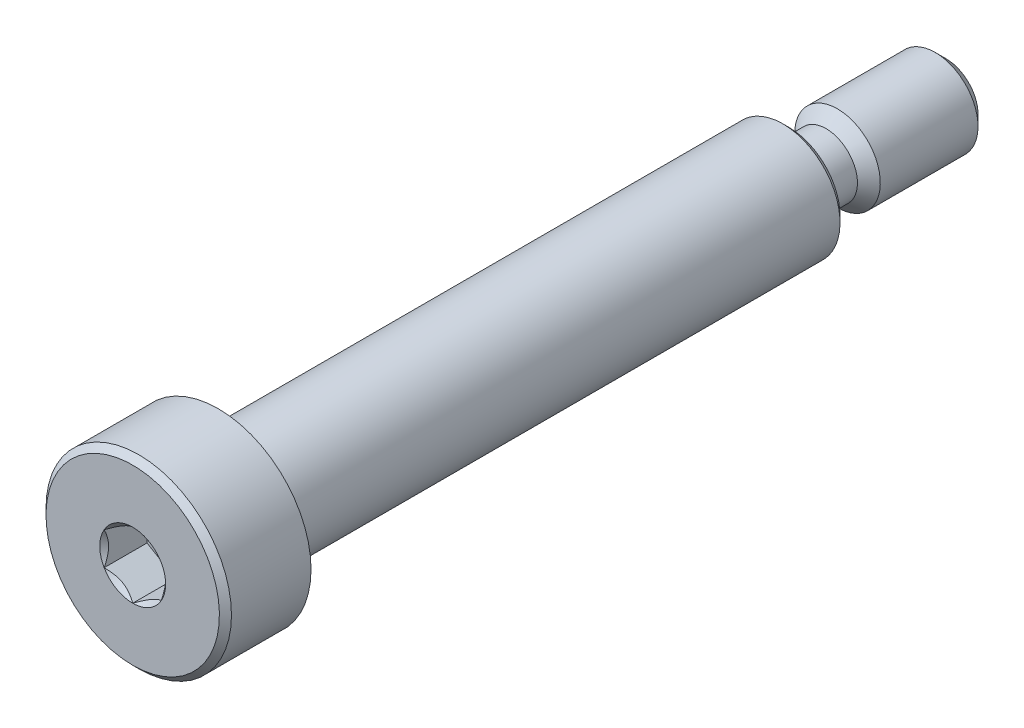
ISO-10303-21;
HEADER;
FILE_DESCRIPTION(('STEP AP214'),'2;1');
FILE_NAME('part.step','',(''),(''),'','','');
FILE_SCHEMA(('AUTOMOTIVE_DESIGN { 1 0 10303 214 1 1 1 1 }'));
ENDSEC;
DATA;
#1=APPLICATION_CONTEXT('core data for automotive mechanical design processes');
#2=APPLICATION_PROTOCOL_DEFINITION('international standard','automotive_design',2000,#1);
#3=PRODUCT_CONTEXT('',#1,'mechanical');
#4=PRODUCT('Part','Part','',(#3));
#5=PRODUCT_RELATED_PRODUCT_CATEGORY('part','',(#4));
#6=PRODUCT_DEFINITION_FORMATION('','',#4);
#7=PRODUCT_DEFINITION_CONTEXT('part definition',#1,'design');
#8=PRODUCT_DEFINITION('design','',#6,#7);
#9=PRODUCT_DEFINITION_SHAPE('','',#8);
#10=(LENGTH_UNIT() NAMED_UNIT(*) SI_UNIT(.MILLI.,.METRE.));
#11=(NAMED_UNIT(*) PLANE_ANGLE_UNIT() SI_UNIT($,.RADIAN.));
#12=(NAMED_UNIT(*) SI_UNIT($,.STERADIAN.) SOLID_ANGLE_UNIT());
#13=UNCERTAINTY_MEASURE_WITH_UNIT(LENGTH_MEASURE(1.E-05),#10,'distance_accuracy_value','');
#14=(GEOMETRIC_REPRESENTATION_CONTEXT(3) GLOBAL_UNCERTAINTY_ASSIGNED_CONTEXT((#13)) GLOBAL_UNIT_ASSIGNED_CONTEXT((#10,
#11,#12)) REPRESENTATION_CONTEXT('',''));
#15=CARTESIAN_POINT('',(0.,0.,0.));
#16=DIRECTION('',(0.,0.,1.));
#17=DIRECTION('',(1.,0.,0.));
#18=AXIS2_PLACEMENT_3D('',#15,#16,#17);
#19=CARTESIAN_POINT('',(0.,0.,-57.));
#20=DIRECTION('',(0.,0.,-1.));
#21=DIRECTION('',(0.,1.,0.));
#22=AXIS2_PLACEMENT_3D('',#19,#20,#21);
#23=CYLINDRICAL_SURFACE('',#22,4.);
#24=CARTESIAN_POINT('',(0.,0.,-45.5775));
#25=DIRECTION('',(0.,0.,-1.));
#26=DIRECTION('',(0.,1.,0.));
#27=AXIS2_PLACEMENT_3D('',#24,#25,#26);
#28=CIRCLE('',#27,4.);
#29=CARTESIAN_POINT('',(0.,4.,-45.5775));
#30=VERTEX_POINT('',#29);
#31=EDGE_CURVE('E257',#30,#30,#28,.F.);
#32=ORIENTED_EDGE('',*,*,#31,.T.);
#33=EDGE_LOOP('',(#32));
#34=FACE_BOUND('',#33,.T.);
#35=CARTESIAN_POINT('',(0.,0.,-7.12666666666666));
#36=DIRECTION('',(0.,0.,-1.));
#37=DIRECTION('',(0.,1.,0.));
#38=AXIS2_PLACEMENT_3D('',#35,#36,#37);
#39=CIRCLE('',#38,4.);
#40=CARTESIAN_POINT('',(0.,4.,-7.12666666666666));
#41=VERTEX_POINT('',#40);
#42=EDGE_CURVE('E285',#41,#41,#39,.T.);
#43=ORIENTED_EDGE('',*,*,#42,.T.);
#44=EDGE_LOOP('',(#43));
#45=FACE_BOUND('',#44,.T.);
#46=ADVANCED_FACE('F41',(#34,#45),#23,.T.);
#47=CARTESIAN_POINT('',(0.,-4.,-46.));
#48=DIRECTION('',(0.,0.,-1.));
#49=DIRECTION('',(0.,1.,0.));
#50=AXIS2_PLACEMENT_3D('',#47,#48,#49);
#51=PLANE('',#50);
#52=CARTESIAN_POINT('',(0.,0.,-46.));
#53=DIRECTION('',(0.,0.,-1.));
#54=DIRECTION('',(0.,1.,0.));
#55=AXIS2_PLACEMENT_3D('',#52,#53,#54);
#56=CIRCLE('',#55,3.5775);
#57=CARTESIAN_POINT('',(0.,3.5775,-46.));
#58=VERTEX_POINT('',#57);
#59=EDGE_CURVE('E260',#58,#58,#56,.T.);
#60=ORIENTED_EDGE('',*,*,#59,.T.);
#61=EDGE_LOOP('',(#60));
#62=FACE_BOUND('',#61,.T.);
#63=CARTESIAN_POINT('',(0.,0.,-46.));
#64=DIRECTION('',(0.,0.,-1.));
#65=DIRECTION('',(0.,1.,0.));
#66=AXIS2_PLACEMENT_3D('',#63,#64,#65);
#67=CIRCLE('',#66,3.00000000000001);
#68=CARTESIAN_POINT('',(0.,3.00000000000001,-46.));
#69=VERTEX_POINT('',#68);
#70=EDGE_CURVE('E311',#69,#69,#67,.T.);
#71=ORIENTED_EDGE('',*,*,#70,.F.);
#72=EDGE_LOOP('',(#71));
#73=FACE_BOUND('',#72,.T.);
#74=ADVANCED_FACE('F211',(#62,#73),#51,.T.);
#75=CARTESIAN_POINT('',(0.,0.,-57.));
#76=DIRECTION('',(0.,0.,-1.));
#77=DIRECTION('',(0.,1.,0.));
#78=AXIS2_PLACEMENT_3D('',#75,#76,#77);
#79=CYLINDRICAL_SURFACE('',#78,3.13333333333333);
#80=CARTESIAN_POINT('',(0.,0.,-6.60666666666668));
#81=DIRECTION('',(0.,0.,-1.));
#82=DIRECTION('',(0.,1.,0.));
#83=AXIS2_PLACEMENT_3D('',#80,#81,#82);
#84=CIRCLE('',#83,3.13333333333333);
#85=CARTESIAN_POINT('',(0.,3.13333333333333,-6.60666666666668));
#86=VERTEX_POINT('',#85);
#87=EDGE_CURVE('E305',#86,#86,#84,.F.);
#88=ORIENTED_EDGE('',*,*,#87,.T.);
#89=EDGE_LOOP('',(#88));
#90=FACE_BOUND('',#89,.T.);
#91=CARTESIAN_POINT('',(0.,0.,-6.));
#92=DIRECTION('',(0.,0.,-1.));
#93=DIRECTION('',(0.,1.,0.));
#94=AXIS2_PLACEMENT_3D('',#91,#92,#93);
#95=CIRCLE('',#94,3.13333333333333);
#96=CARTESIAN_POINT('',(0.,3.13333333333333,-6.));
#97=VERTEX_POINT('',#96);
#98=EDGE_CURVE('E286',#97,#97,#95,.T.);
#99=ORIENTED_EDGE('',*,*,#98,.T.);
#100=EDGE_LOOP('',(#99));
#101=FACE_BOUND('',#100,.T.);
#102=ADVANCED_FACE('F217',(#90,#101),#79,.T.);
#103=CARTESIAN_POINT('',(0.,4.,-6.86666666666667));
#104=DIRECTION('',(0.,0.,-1.));
#105=DIRECTION('',(0.,1.,0.));
#106=AXIS2_PLACEMENT_3D('',#103,#104,#105);
#107=PLANE('',#106);
#108=CARTESIAN_POINT('',(0.,0.,-6.86666666666667));
#109=DIRECTION('',(0.,0.,-1.));
#110=DIRECTION('',(0.,1.,0.));
#111=AXIS2_PLACEMENT_3D('',#108,#109,#110);
#112=CIRCLE('',#111,3.73999999999999);
#113=CARTESIAN_POINT('',(0.,3.73999999999999,-6.86666666666667));
#114=VERTEX_POINT('',#113);
#115=EDGE_CURVE('E301',#114,#114,#112,.F.);
#116=ORIENTED_EDGE('',*,*,#115,.T.);
#117=EDGE_LOOP('',(#116));
#118=FACE_BOUND('',#117,.T.);
#119=CARTESIAN_POINT('',(0.,0.,-6.86666666666667));
#120=DIRECTION('',(0.,0.,-1.));
#121=DIRECTION('',(0.,1.,0.));
#122=AXIS2_PLACEMENT_3D('',#119,#120,#121);
#123=CIRCLE('',#122,3.39333333333332);
#124=CARTESIAN_POINT('',(0.,3.39333333333332,-6.86666666666667));
#125=VERTEX_POINT('',#124);
#126=EDGE_CURVE('E291',#125,#125,#123,.T.);
#127=ORIENTED_EDGE('',*,*,#126,.T.);
#128=EDGE_LOOP('',(#127));
#129=FACE_BOUND('',#128,.T.);
#130=ADVANCED_FACE('F235',(#118,#129),#107,.F.);
#131=CARTESIAN_POINT('',(0.,0.,0.));
#132=DIRECTION('',(0.,0.,1.));
#133=DIRECTION('',(0.,-1.,0.));
#134=AXIS2_PLACEMENT_3D('',#131,#132,#133);
#135=PLANE('',#134);
#136=CARTESIAN_POINT('',(0.,0.,0.));
#137=DIRECTION('',(0.,0.,1.));
#138=DIRECTION('',(1.,0.,0.));
#139=AXIS2_PLACEMENT_3D('',#136,#137,#138);
#140=CIRCLE('',#139,2.3094010767585);
#141=CARTESIAN_POINT('',(0.,-2.3094010767585,0.));
#142=VERTEX_POINT('',#141);
#143=CARTESIAN_POINT('',(2.,-1.15470053837925,0.));
#144=VERTEX_POINT('',#143);
#145=EDGE_CURVE('E62',#142,#144,#140,.T.);
#146=ORIENTED_EDGE('',*,*,#145,.F.);
#147=CARTESIAN_POINT('',(-2.,-1.15470053837925,0.));
#148=VERTEX_POINT('',#147);
#149=EDGE_CURVE('E69',#148,#142,#140,.T.);
#150=ORIENTED_EDGE('',*,*,#149,.F.);
#151=CARTESIAN_POINT('',(-2.,1.15470053837925,0.));
#152=VERTEX_POINT('',#151);
#153=EDGE_CURVE('E149',#152,#148,#140,.T.);
#154=ORIENTED_EDGE('',*,*,#153,.F.);
#155=CARTESIAN_POINT('',(0.,2.3094010767585,0.));
#156=VERTEX_POINT('',#155);
#157=EDGE_CURVE('E141',#156,#152,#140,.T.);
#158=ORIENTED_EDGE('',*,*,#157,.F.);
#159=CARTESIAN_POINT('',(2.,1.15470053837925,0.));
#160=VERTEX_POINT('',#159);
#161=EDGE_CURVE('E111',#160,#156,#140,.T.);
#162=ORIENTED_EDGE('',*,*,#161,.F.);
#163=EDGE_CURVE('E101',#144,#160,#140,.T.);
#164=ORIENTED_EDGE('',*,*,#163,.F.);
#165=EDGE_LOOP('',(#146,#150,#154,#158,#162,#164));
#166=FACE_BOUND('',#165,.T.);
#167=CARTESIAN_POINT('',(0.,0.,0.));
#168=DIRECTION('',(0.,0.,1.));
#169=DIRECTION('',(0.,-1.,0.));
#170=AXIS2_PLACEMENT_3D('',#167,#168,#169);
#171=CIRCLE('',#170,6.0775);
#172=CARTESIAN_POINT('',(0.,-6.0775,0.));
#173=VERTEX_POINT('',#172);
#174=EDGE_CURVE('E56',#173,#173,#171,.T.);
#175=ORIENTED_EDGE('',*,*,#174,.T.);
#176=EDGE_LOOP('',(#175));
#177=FACE_BOUND('',#176,.T.);
#178=ADVANCED_FACE('F138',(#166,#177),#135,.T.);
#179=CARTESIAN_POINT('',(0.,0.,-57.));
#180=DIRECTION('',(0.,0.,-1.));
#181=DIRECTION('',(0.,1.,0.));
#182=AXIS2_PLACEMENT_3D('',#179,#180,#181);
#183=CYLINDRICAL_SURFACE('',#182,6.5);
#184=CARTESIAN_POINT('',(0.,0.,-0.422499999999992));
#185=DIRECTION('',(0.,0.,1.));
#186=DIRECTION('',(0.,-1.,0.));
#187=AXIS2_PLACEMENT_3D('',#184,#185,#186);
#188=CIRCLE('',#187,6.5);
#189=CARTESIAN_POINT('',(0.,-6.5,-0.422499999999992));
#190=VERTEX_POINT('',#189);
#191=EDGE_CURVE('E266',#190,#190,#188,.F.);
#192=ORIENTED_EDGE('',*,*,#191,.T.);
#193=EDGE_LOOP('',(#192));
#194=FACE_BOUND('',#193,.T.);
#195=CARTESIAN_POINT('',(0.,0.,-6.));
#196=DIRECTION('',(0.,0.,-1.));
#197=DIRECTION('',(0.,1.,0.));
#198=AXIS2_PLACEMENT_3D('',#195,#196,#197);
#199=CIRCLE('',#198,6.5);
#200=CARTESIAN_POINT('',(0.,6.5,-6.));
#201=VERTEX_POINT('',#200);
#202=EDGE_CURVE('E283',#201,#201,#199,.T.);
#203=ORIENTED_EDGE('',*,*,#202,.F.);
#204=EDGE_LOOP('',(#203));
#205=FACE_BOUND('',#204,.T.);
#206=ADVANCED_FACE('F228',(#194,#205),#183,.T.);
#207=CARTESIAN_POINT('',(0.,-6.5,-6.));
#208=DIRECTION('',(0.,0.,-1.));
#209=DIRECTION('',(0.,1.,0.));
#210=AXIS2_PLACEMENT_3D('',#207,#208,#209);
#211=PLANE('',#210);
#212=ORIENTED_EDGE('',*,*,#202,.T.);
#213=EDGE_LOOP('',(#212));
#214=FACE_BOUND('',#213,.T.);
#215=ORIENTED_EDGE('',*,*,#98,.F.);
#216=EDGE_LOOP('',(#215));
#217=FACE_BOUND('',#216,.T.);
#218=ADVANCED_FACE('F224',(#214,#217),#211,.T.);
#219=CARTESIAN_POINT('',(0.,0.,-7.12666666666666));
#220=DIRECTION('',(0.,0.,-1.));
#221=DIRECTION('',(0.,1.,0.));
#222=AXIS2_PLACEMENT_3D('',#219,#220,#221);
#223=CONICAL_SURFACE('',#222,4.,0.785398163397465);
#224=ORIENTED_EDGE('',*,*,#115,.F.);
#225=EDGE_LOOP('',(#224));
#226=FACE_BOUND('',#225,.T.);
#227=ORIENTED_EDGE('',*,*,#42,.F.);
#228=EDGE_LOOP('',(#227));
#229=FACE_BOUND('',#228,.T.);
#230=ADVANCED_FACE('F227',(#226,#229),#223,.T.);
#231=CARTESIAN_POINT('',(0.,0.,-6.86666666666667));
#232=DIRECTION('',(0.,0.,-1.));
#233=DIRECTION('',(0.,1.,0.));
#234=AXIS2_PLACEMENT_3D('',#231,#232,#233);
#235=CONICAL_SURFACE('',#234,3.39333333333332,0.785398163397454);
#236=ORIENTED_EDGE('',*,*,#87,.F.);
#237=EDGE_LOOP('',(#236));
#238=FACE_BOUND('',#237,.T.);
#239=ORIENTED_EDGE('',*,*,#126,.F.);
#240=EDGE_LOOP('',(#239));
#241=FACE_BOUND('',#240,.T.);
#242=ADVANCED_FACE('F238',(#238,#241),#235,.T.);
#243=CARTESIAN_POINT('',(0.,0.,-46.8));
#244=DIRECTION('',(0.,0.,-1.));
#245=DIRECTION('',(0.,1.,0.));
#246=AXIS2_PLACEMENT_3D('',#243,#244,#245);
#247=TOROIDAL_SURFACE('',#246,3.00000000000001,0.800000000000009);
#248=CARTESIAN_POINT('',(0.,0.,-46.8));
#249=DIRECTION('',(0.,0.,-1.));
#250=DIRECTION('',(0.,1.,0.));
#251=AXIS2_PLACEMENT_3D('',#248,#249,#250);
#252=CIRCLE('',#251,2.2);
#253=CARTESIAN_POINT('',(0.,2.2,-46.8));
#254=VERTEX_POINT('',#253);
#255=EDGE_CURVE('E389',#254,#254,#252,.T.);
#256=ORIENTED_EDGE('',*,*,#255,.F.);
#257=EDGE_LOOP('',(#256));
#258=FACE_BOUND('',#257,.T.);
#259=ORIENTED_EDGE('',*,*,#70,.T.);
#260=EDGE_LOOP('',(#259));
#261=FACE_BOUND('',#260,.T.);
#262=ADVANCED_FACE('F242',(#258,#261),#247,.F.);
#263=CARTESIAN_POINT('',(0.,0.,-57.));
#264=DIRECTION('',(0.,0.,-1.));
#265=DIRECTION('',(0.,1.,0.));
#266=AXIS2_PLACEMENT_3D('',#263,#264,#265);
#267=CYLINDRICAL_SURFACE('',#266,2.2);
#268=CARTESIAN_POINT('',(0.,0.,-48.6));
#269=DIRECTION('',(0.,0.,-1.));
#270=DIRECTION('',(0.,1.,0.));
#271=AXIS2_PLACEMENT_3D('',#268,#269,#270);
#272=CIRCLE('',#271,2.2);
#273=CARTESIAN_POINT('',(0.,2.2,-48.6));
#274=VERTEX_POINT('',#273);
#275=EDGE_CURVE('E373',#274,#274,#272,.T.);
#276=ORIENTED_EDGE('',*,*,#275,.F.);
#277=EDGE_LOOP('',(#276));
#278=FACE_BOUND('',#277,.T.);
#279=ORIENTED_EDGE('',*,*,#255,.T.);
#280=EDGE_LOOP('',(#279));
#281=FACE_BOUND('',#280,.T.);
#282=ADVANCED_FACE('F326',(#278,#281),#267,.T.);
#283=CARTESIAN_POINT('',(0.,0.,-48.6));
#284=DIRECTION('',(0.,0.,-1.));
#285=DIRECTION('',(0.,1.,0.));
#286=AXIS2_PLACEMENT_3D('',#283,#284,#285);
#287=CONICAL_SURFACE('',#286,2.2,0.785398163397445);
#288=CARTESIAN_POINT('',(0.,0.,-49.4));
#289=DIRECTION('',(0.,0.,-1.));
#290=DIRECTION('',(0.,1.,0.));
#291=AXIS2_PLACEMENT_3D('',#288,#289,#290);
#292=CIRCLE('',#291,3.00000000000001);
#293=CARTESIAN_POINT('',(0.,3.00000000000001,-49.4));
#294=VERTEX_POINT('',#293);
#295=EDGE_CURVE('E294',#294,#294,#292,.F.);
#296=ORIENTED_EDGE('',*,*,#295,.T.);
#297=EDGE_LOOP('',(#296));
#298=FACE_BOUND('',#297,.T.);
#299=ORIENTED_EDGE('',*,*,#275,.T.);
#300=EDGE_LOOP('',(#299));
#301=FACE_BOUND('',#300,.T.);
#302=ADVANCED_FACE('F319',(#298,#301),#287,.T.);
#303=CARTESIAN_POINT('',(0.,-3.00000000000001,-57.));
#304=DIRECTION('',(0.,0.,-1.));
#305=DIRECTION('',(0.,1.,0.));
#306=AXIS2_PLACEMENT_3D('',#303,#304,#305);
#307=PLANE('',#306);
#308=CARTESIAN_POINT('',(0.,0.,-57.));
#309=DIRECTION('',(0.,0.,-1.));
#310=DIRECTION('',(0.,1.,0.));
#311=AXIS2_PLACEMENT_3D('',#308,#309,#310);
#312=CIRCLE('',#311,2.25);
#313=CARTESIAN_POINT('',(0.,2.25,-57.));
#314=VERTEX_POINT('',#313);
#315=EDGE_CURVE('E269',#314,#314,#312,.T.);
#316=ORIENTED_EDGE('',*,*,#315,.T.);
#317=EDGE_LOOP('',(#316));
#318=FACE_BOUND('',#317,.T.);
#319=ADVANCED_FACE('F316',(#318),#307,.T.);
#320=CARTESIAN_POINT('',(0.,0.,-57.));
#321=DIRECTION('',(0.,0.,-1.));
#322=DIRECTION('',(0.,1.,0.));
#323=AXIS2_PLACEMENT_3D('',#320,#321,#322);
#324=CYLINDRICAL_SURFACE('',#323,3.00000000000001);
#325=CARTESIAN_POINT('',(0.,0.,-56.25));
#326=DIRECTION('',(0.,0.,-1.));
#327=DIRECTION('',(0.,1.,0.));
#328=AXIS2_PLACEMENT_3D('',#325,#326,#327);
#329=CIRCLE('',#328,3.00000000000001);
#330=CARTESIAN_POINT('',(0.,3.00000000000001,-56.25));
#331=VERTEX_POINT('',#330);
#332=EDGE_CURVE('E262',#331,#331,#329,.F.);
#333=ORIENTED_EDGE('',*,*,#332,.T.);
#334=EDGE_LOOP('',(#333));
#335=FACE_BOUND('',#334,.T.);
#336=ORIENTED_EDGE('',*,*,#295,.F.);
#337=EDGE_LOOP('',(#336));
#338=FACE_BOUND('',#337,.T.);
#339=ADVANCED_FACE('F247',(#335,#338),#324,.T.);
#340=CARTESIAN_POINT('',(0.,0.,-57.));
#341=DIRECTION('',(0.,0.,1.));
#342=DIRECTION('',(0.,-1.,0.));
#343=AXIS2_PLACEMENT_3D('',#340,#341,#342);
#344=CONICAL_SURFACE('',#343,2.25,0.785398163397446);
#345=ORIENTED_EDGE('',*,*,#332,.F.);
#346=EDGE_LOOP('',(#345));
#347=FACE_BOUND('',#346,.T.);
#348=ORIENTED_EDGE('',*,*,#315,.F.);
#349=EDGE_LOOP('',(#348));
#350=FACE_BOUND('',#349,.T.);
#351=ADVANCED_FACE('F244',(#347,#350),#344,.T.);
#352=CARTESIAN_POINT('',(0.,0.,-46.));
#353=DIRECTION('',(0.,0.,1.));
#354=DIRECTION('',(0.,-1.,0.));
#355=AXIS2_PLACEMENT_3D('',#352,#353,#354);
#356=CONICAL_SURFACE('',#355,3.5775,0.78539816339745);
#357=ORIENTED_EDGE('',*,*,#31,.F.);
#358=EDGE_LOOP('',(#357));
#359=FACE_BOUND('',#358,.T.);
#360=ORIENTED_EDGE('',*,*,#59,.F.);
#361=EDGE_LOOP('',(#360));
#362=FACE_BOUND('',#361,.T.);
#363=ADVANCED_FACE('F246',(#359,#362),#356,.T.);
#364=CARTESIAN_POINT('',(0.,0.,-0.422499999999992));
#365=DIRECTION('',(0.,0.,-1.));
#366=DIRECTION('',(0.,1.,0.));
#367=AXIS2_PLACEMENT_3D('',#364,#365,#366);
#368=CONICAL_SURFACE('',#367,6.5,0.785398163397453);
#369=ORIENTED_EDGE('',*,*,#174,.F.);
#370=EDGE_LOOP('',(#369));
#371=FACE_BOUND('',#370,.T.);
#372=ORIENTED_EDGE('',*,*,#191,.F.);
#373=EDGE_LOOP('',(#372));
#374=FACE_BOUND('',#373,.T.);
#375=ADVANCED_FACE('F43',(#371,#374),#368,.T.);
#376=CARTESIAN_POINT('',(0.,0.,0.));
#377=DIRECTION('',(0.,0.,1.));
#378=DIRECTION('',(1.,0.,0.));
#379=AXIS2_PLACEMENT_3D('',#376,#377,#378);
#380=CONICAL_SURFACE('',#379,2.3094010767585,0.78539816339745);
#381=ORIENTED_EDGE('',*,*,#161,.T.);
#382=CARTESIAN_POINT('',(2.0002,1.15458506832541,0.000115478713657903));
#383=CARTESIAN_POINT('',(1.93144696596929,1.19427965103064,-0.0395469097744095));
#384=CARTESIAN_POINT('',(1.86154425786449,1.23463799837204,-0.0768800177158397));
#385=CARTESIAN_POINT('',(1.71900475544956,1.31693321846145,-0.145236314863858));
#386=CARTESIAN_POINT('',(1.64635440243464,1.35887791933134,-0.176221466262781));
#387=CARTESIAN_POINT('',(1.49985839894603,1.44345742638069,-0.229299783455859));
#388=CARTESIAN_POINT('',(1.42605006475371,1.48607068799507,-0.251526372823391));
#389=CARTESIAN_POINT('',(1.27680836816474,1.57223542169503,-0.285771183324921));
#390=CARTESIAN_POINT('',(1.20137956608185,1.61578426088223,-0.297814970855866));
#391=CARTESIAN_POINT('',(1.07138449932892,1.69083694766536,-0.308681488094429));
#392=CARTESIAN_POINT('',(1.01698621602989,1.72224381117151,-0.310290246390031));
#393=CARTESIAN_POINT('',(0.908278544480306,1.78500621460364,-0.30758112240129));
#394=CARTESIAN_POINT('',(0.853969194078661,1.81636173267754,-0.303261162242027));
#395=CARTESIAN_POINT('',(0.745863272410662,1.87877671565355,-0.288940432590096));
#396=CARTESIAN_POINT('',(0.692067343445208,1.90983580972306,-0.278933307237995));
#397=CARTESIAN_POINT('',(0.585405737694427,1.97141691651547,-0.253787569750342));
#398=CARTESIAN_POINT('',(0.532539989929288,2.00193897021859,-0.238649350957762));
#399=CARTESIAN_POINT('',(0.397120266910156,2.08012358375727,-0.193705496570811));
#400=CARTESIAN_POINT('',(0.315406165150522,2.12730124240478,-0.160511160574185));
#401=CARTESIAN_POINT('',(0.195252962742198,2.19667172615922,-0.104474176828631));
#402=CARTESIAN_POINT('',(0.155657147890823,2.21953238052245,-0.0847852970530612));
#403=CARTESIAN_POINT('',(0.0771990411121275,2.26483018959124,-0.0436126816351299));
#404=CARTESIAN_POINT('',(0.0383363164062595,2.28726759416161,-0.0221300483487543));
#405=CARTESIAN_POINT('',(-0.000200000000000218,2.30951654681234,0.000115478713658603));
#406=B_SPLINE_CURVE_WITH_KNOTS('',3,(#382,#383,#384,#385,#386,#387,#388,#389,#390,#391,#392,
#393,#394,#395,#396,#397,#398,#399,#400,#401,#402,#403,#404,#405),.UNSPECIFIED.,.F.,.F.,(4,2,2,
2,2,2,2,2,2,2,2,4),(0.,0.266420613771064,0.534393751523388,0.798110374376914,1.06116288956936,
1.24939906803722,1.43770123566247,1.62621426093932,1.81471283831913,2.11415604834145,
2.26347170717791,2.41269626969771),.UNSPECIFIED.);
#407=EDGE_CURVE('E11',#160,#156,#406,.T.);
#408=ORIENTED_EDGE('',*,*,#407,.F.);
#409=EDGE_LOOP('',(#381,#408));
#410=FACE_BOUND('',#409,.T.);
#411=ADVANCED_FACE('F114',(#410),#380,.F.);
#412=ORIENTED_EDGE('',*,*,#157,.T.);
#413=CARTESIAN_POINT('',(0.000199999999999892,2.30951654681234,0.000115478713658207));
#414=CARTESIAN_POINT('',(-0.0685530340307056,2.26982196410711,-0.0395469097744092));
#415=CARTESIAN_POINT('',(-0.138455742135512,2.22946361676572,-0.0768800177158394));
#416=CARTESIAN_POINT('',(-0.280995244550436,2.1471683966763,-0.145236314863858));
#417=CARTESIAN_POINT('',(-0.353645597565358,2.10522369580642,-0.17622146626278));
#418=CARTESIAN_POINT('',(-0.500141601053971,2.02064418875706,-0.229299783455859));
#419=CARTESIAN_POINT('',(-0.573949935246294,1.97803092714269,-0.25152637282339));
#420=CARTESIAN_POINT('',(-0.723191631835264,1.89186619344273,-0.285771183324921));
#421=CARTESIAN_POINT('',(-0.798620433918152,1.84831735425552,-0.297814970855866));
#422=CARTESIAN_POINT('',(-0.928615500671079,1.7732646674724,-0.308681488094429));
#423=CARTESIAN_POINT('',(-0.983013783970108,1.74185780396625,-0.31029024639003));
#424=CARTESIAN_POINT('',(-1.09172145551969,1.67909540053412,-0.30758112240129));
#425=CARTESIAN_POINT('',(-1.14603080592134,1.64773988246021,-0.303261162242027));
#426=CARTESIAN_POINT('',(-1.25413672758934,1.5853248994842,-0.288940432590095));
#427=CARTESIAN_POINT('',(-1.30793265655479,1.55426580541469,-0.278933307237994));
#428=CARTESIAN_POINT('',(-1.41459426230557,1.49268469862228,-0.253787569750341));
#429=CARTESIAN_POINT('',(-1.46746001007071,1.46216264491917,-0.238649350957761));
#430=CARTESIAN_POINT('',(-1.60287973308984,1.38397803138049,-0.193705496570811));
#431=CARTESIAN_POINT('',(-1.68459383484948,1.33680037273297,-0.160511160574185));
#432=CARTESIAN_POINT('',(-1.8047470372578,1.26742988897853,-0.104474176828631));
#433=CARTESIAN_POINT('',(-1.84434285210918,1.24456923461531,-0.0847852970530608));
#434=CARTESIAN_POINT('',(-1.92280095888787,1.19927142554652,-0.0436126816351294));
#435=CARTESIAN_POINT('',(-1.96166368359374,1.17683402097614,-0.0221300483487537));
#436=CARTESIAN_POINT('',(-2.0002,1.15458506832541,0.000115478713658604));
#437=B_SPLINE_CURVE_WITH_KNOTS('',3,(#413,#414,#415,#416,#417,#418,#419,#420,#421,#422,#423,
#424,#425,#426,#427,#428,#429,#430,#431,#432,#433,#434,#435,#436),.UNSPECIFIED.,.F.,.F.,(4,2,2,
2,2,2,2,2,2,2,2,4),(0.,0.266420613771064,0.534393751523388,0.798110374376914,1.06116288956936,
1.24939906803722,1.43770123566247,1.62621426093932,1.81471283831913,2.11415604834145,
2.2634717071779,2.41269626969771),.UNSPECIFIED.);
#438=EDGE_CURVE('E143',#156,#152,#437,.T.);
#439=ORIENTED_EDGE('',*,*,#438,.F.);
#440=EDGE_LOOP('',(#412,#439));
#441=FACE_BOUND('',#440,.T.);
#442=ADVANCED_FACE('F417',(#441),#380,.F.);
#443=ORIENTED_EDGE('',*,*,#153,.T.);
#444=CARTESIAN_POINT('',(-2.,-2.30294417292923,0.740771355027721));
#445=CARTESIAN_POINT('',(-2.,-2.24687002663712,0.698443273625963));
#446=CARTESIAN_POINT('',(-2.,-2.19048190536959,0.656525156864337));
#447=CARTESIAN_POINT('',(-2.,-2.07695390496424,0.573690417861017));
#448=CARTESIAN_POINT('',(-2.,-2.01981384066454,0.532774049668074));
#449=CARTESIAN_POINT('',(-2.,-1.90424016804776,0.451833452018563));
#450=CARTESIAN_POINT('',(-2.,-1.8457999674391,0.411818591559868));
#451=CARTESIAN_POINT('',(-2.,-1.7279274546176,0.333288993664293));
#452=CARTESIAN_POINT('',(-2.,-1.66849521292324,0.294774150243142));
#453=CARTESIAN_POINT('',(-2.,-1.4816299571002,0.177640651604294));
#454=CARTESIAN_POINT('',(-2.,-1.35220318163536,0.102145901729644));
#455=CARTESIAN_POINT('',(-2.,-1.08689521592924,-0.0359506490056195));
#456=CARTESIAN_POINT('',(-2.,-0.951037763938191,-0.0985959140965047));
#457=CARTESIAN_POINT('',(-2.,-0.747111912259408,-0.175236456124857));
#458=CARTESIAN_POINT('',(-2.,-0.682064034147875,-0.197232820080877));
#459=CARTESIAN_POINT('',(-2.,-0.550398103294751,-0.236003312339861));
#460=CARTESIAN_POINT('',(-2.,-0.483779942722474,-0.252777080878818));
#461=CARTESIAN_POINT('',(-2.,-0.350484328847653,-0.279951742115555));
#462=CARTESIAN_POINT('',(-2.,-0.283829489364785,-0.290461823258314));
#463=CARTESIAN_POINT('',(-2.,-0.149806987139376,-0.304903914455085));
#464=CARTESIAN_POINT('',(-2.,-0.0824394489341211,-0.308837055266887));
#465=CARTESIAN_POINT('',(-2.,0.0499055622944905,-0.309833523066283));
#466=CARTESIAN_POINT('',(-2.,0.114881285143173,-0.307140355149592));
#467=CARTESIAN_POINT('',(-2.,0.244275921482761,-0.295569929577308));
#468=CARTESIAN_POINT('',(-2.,0.308694780266754,-0.286692071166776));
#469=CARTESIAN_POINT('',(-2.,0.437599788610706,-0.263086340703852));
#470=CARTESIAN_POINT('',(-2.,0.502067428644596,-0.248258916553489));
#471=CARTESIAN_POINT('',(-2.,0.629594322598307,-0.21354211637203));
#472=CARTESIAN_POINT('',(-2.,0.692653693883152,-0.193653163893725));
#473=CARTESIAN_POINT('',(-2.,0.891187889210546,-0.123553020743801));
#474=CARTESIAN_POINT('',(-2.,1.02383545707306,-0.0653581996784916));
#475=CARTESIAN_POINT('',(-2.,1.28290932150074,0.0640305754595761));
#476=CARTESIAN_POINT('',(-2.,1.4093111258757,0.135271231414841));
#477=CARTESIAN_POINT('',(-2.,1.59200441438963,0.24644199187472));
#478=CARTESIAN_POINT('',(-2.,1.65027549026191,0.283182190337374));
#479=CARTESIAN_POINT('',(-2.,1.76581760389243,0.358214514183765));
#480=CARTESIAN_POINT('',(-2.,1.82308856543105,0.396506757118039));
#481=CARTESIAN_POINT('',(-2.,1.93629654762084,0.474042264081225));
#482=CARTESIAN_POINT('',(-2.,1.99224062500539,0.513275276133584));
#483=CARTESIAN_POINT('',(-2.,2.103364240299,0.592778830736515));
#484=CARTESIAN_POINT('',(-2.,2.15854398422468,0.633049085000597));
#485=CARTESIAN_POINT('',(-2.,2.21340370692659,0.673744238145942));
#486=B_SPLINE_CURVE_WITH_KNOTS('',3,(#444,#445,#446,#447,#448,#449,#450,#451,#452,#453,#454,
#455,#456,#457,#458,#459,#460,#461,#462,#463,#464,#465,#466,#467,#468,#469,#470,#471,#472,#473,
#474,#475,#476,#477,#478,#479,#480,#481,#482,#483,#484,#485),.UNSPECIFIED.,.F.,.F.,(4,2,2,2,2,2,
2,2,2,2,2,2,2,2,2,2,2,2,2,2,4),(0.,0.210772731976891,0.421598374658589,0.634057554623487,
0.84650169587017,1.29562155455624,1.74319622821645,1.94902062110207,2.15485918928326,
2.35699582502635,2.5590977043214,2.75388435553556,2.94868993014815,3.14690093452586,
3.34509535789702,3.77838155837654,4.21325029921625,4.41989056685647,4.62654651460921,
4.8315237711129,5.03644465914085),.UNSPECIFIED.);
#487=EDGE_CURVE('E147',#152,#148,#486,.F.);
#488=ORIENTED_EDGE('',*,*,#487,.F.);
#489=EDGE_LOOP('',(#443,#488));
#490=FACE_BOUND('',#489,.T.);
#491=ADVANCED_FACE('F412',(#490),#380,.F.);
#492=ORIENTED_EDGE('',*,*,#149,.T.);
#493=CARTESIAN_POINT('',(-2.0002,-1.15458506832541,0.000115478713658338));
#494=CARTESIAN_POINT('',(-1.93144696596929,-1.19427965103064,-0.039546909774409));
#495=CARTESIAN_POINT('',(-1.86154425786449,-1.23463799837204,-0.0768800177158393));
#496=CARTESIAN_POINT('',(-1.71900475544956,-1.31693321846145,-0.145236314863858));
#497=CARTESIAN_POINT('',(-1.64635440243464,-1.35887791933134,-0.17622146626278));
#498=CARTESIAN_POINT('',(-1.49985839894603,-1.44345742638069,-0.229299783455859));
#499=CARTESIAN_POINT('',(-1.42605006475371,-1.48607068799507,-0.25152637282339));
#500=CARTESIAN_POINT('',(-1.27680836816474,-1.57223542169503,-0.285771183324921));
#501=CARTESIAN_POINT('',(-1.20137956608185,-1.61578426088223,-0.297814970855866));
#502=CARTESIAN_POINT('',(-1.07138449932892,-1.69083694766536,-0.308681488094429));
#503=CARTESIAN_POINT('',(-1.01698621602989,-1.72224381117151,-0.31029024639003));
#504=CARTESIAN_POINT('',(-0.908278544480308,-1.78500621460364,-0.30758112240129));
#505=CARTESIAN_POINT('',(-0.853969194078662,-1.81636173267754,-0.303261162242027));
#506=CARTESIAN_POINT('',(-0.745863272410663,-1.87877671565355,-0.288940432590096));
#507=CARTESIAN_POINT('',(-0.692067343445209,-1.90983580972306,-0.278933307237995));
#508=CARTESIAN_POINT('',(-0.585405737694428,-1.97141691651547,-0.253787569750342));
#509=CARTESIAN_POINT('',(-0.532539989929289,-2.00193897021859,-0.238649350957761));
#510=CARTESIAN_POINT('',(-0.397120266910157,-2.08012358375727,-0.193705496570811));
#511=CARTESIAN_POINT('',(-0.315406165150523,-2.12730124240478,-0.160511160574185));
#512=CARTESIAN_POINT('',(-0.195252962742198,-2.19667172615922,-0.104474176828631));
#513=CARTESIAN_POINT('',(-0.155657147890824,-2.21953238052245,-0.0847852970530612));
#514=CARTESIAN_POINT('',(-0.0771990411121284,-2.26483018959123,-0.0436126816351299));
#515=CARTESIAN_POINT('',(-0.0383363164062603,-2.28726759416161,-0.0221300483487542));
#516=CARTESIAN_POINT('',(0.000199999999999271,-2.30951654681234,0.000115478713658475));
#517=B_SPLINE_CURVE_WITH_KNOTS('',3,(#493,#494,#495,#496,#497,#498,#499,#500,#501,#502,#503,
#504,#505,#506,#507,#508,#509,#510,#511,#512,#513,#514,#515,#516),.UNSPECIFIED.,.F.,.F.,(4,2,2,
2,2,2,2,2,2,2,2,4),(0.,0.266420613771063,0.534393751523388,0.798110374376913,1.06116288956936,
1.24939906803722,1.43770123566247,1.62621426093931,1.81471283831913,2.11415604834145,
2.2634717071779,2.41269626969771),.UNSPECIFIED.);
#518=EDGE_CURVE('E175',#148,#142,#517,.T.);
#519=ORIENTED_EDGE('',*,*,#518,.F.);
#520=EDGE_LOOP('',(#492,#519));
#521=FACE_BOUND('',#520,.T.);
#522=ADVANCED_FACE('F416',(#521),#380,.F.);
#523=ORIENTED_EDGE('',*,*,#145,.T.);
#524=CARTESIAN_POINT('',(-0.000200000000000641,-2.30951654681234,0.000115478713658207));
#525=CARTESIAN_POINT('',(0.0685530340307048,-2.26982196410711,-0.0395469097744092));
#526=CARTESIAN_POINT('',(0.138455742135511,-2.22946361676572,-0.0768800177158394));
#527=CARTESIAN_POINT('',(0.280995244550436,-2.1471683966763,-0.145236314863858));
#528=CARTESIAN_POINT('',(0.353645597565358,-2.10522369580642,-0.17622146626278));
#529=CARTESIAN_POINT('',(0.500141601053971,-2.02064418875706,-0.229299783455859));
#530=CARTESIAN_POINT('',(0.573949935246294,-1.97803092714269,-0.251526372823391));
#531=CARTESIAN_POINT('',(0.723191631835264,-1.89186619344273,-0.285771183324921));
#532=CARTESIAN_POINT('',(0.798620433918152,-1.84831735425552,-0.297814970855866));
#533=CARTESIAN_POINT('',(0.928615500671079,-1.7732646674724,-0.308681488094429));
#534=CARTESIAN_POINT('',(0.983013783970109,-1.74185780396625,-0.310290246390031));
#535=CARTESIAN_POINT('',(1.09172145551969,-1.67909540053412,-0.30758112240129));
#536=CARTESIAN_POINT('',(1.14603080592134,-1.64773988246021,-0.303261162242027));
#537=CARTESIAN_POINT('',(1.25413672758934,-1.5853248994842,-0.288940432590095));
#538=CARTESIAN_POINT('',(1.30793265655479,-1.55426580541469,-0.278933307237995));
#539=CARTESIAN_POINT('',(1.41459426230557,-1.49268469862228,-0.253787569750342));
#540=CARTESIAN_POINT('',(1.46746001007071,-1.46216264491917,-0.238649350957762));
#541=CARTESIAN_POINT('',(1.60287973308984,-1.38397803138049,-0.193705496570811));
#542=CARTESIAN_POINT('',(1.68459383484948,-1.33680037273297,-0.160511160574186));
#543=CARTESIAN_POINT('',(1.8047470372578,-1.26742988897853,-0.104474176828632));
#544=CARTESIAN_POINT('',(1.84434285210918,-1.24456923461531,-0.0847852970530611));
#545=CARTESIAN_POINT('',(1.92280095888787,-1.19927142554652,-0.0436126816351297));
#546=CARTESIAN_POINT('',(1.96166368359374,-1.17683402097614,-0.0221300483487541));
#547=CARTESIAN_POINT('',(2.0002,-1.15458506832541,0.000115478713658334));
#548=B_SPLINE_CURVE_WITH_KNOTS('',3,(#524,#525,#526,#527,#528,#529,#530,#531,#532,#533,#534,
#535,#536,#537,#538,#539,#540,#541,#542,#543,#544,#545,#546,#547),.UNSPECIFIED.,.F.,.F.,(4,2,2,
2,2,2,2,2,2,2,2,4),(0.,0.266420613771064,0.534393751523388,0.798110374376914,1.06116288956936,
1.24939906803722,1.43770123566247,1.62621426093932,1.81471283831913,2.11415604834145,
2.26347170717791,2.41269626969771),.UNSPECIFIED.);
#549=EDGE_CURVE('E127',#142,#144,#548,.T.);
#550=ORIENTED_EDGE('',*,*,#549,.F.);
#551=EDGE_LOOP('',(#523,#550));
#552=FACE_BOUND('',#551,.T.);
#553=ADVANCED_FACE('F168',(#552),#380,.F.);
#554=ORIENTED_EDGE('',*,*,#163,.T.);
#555=CARTESIAN_POINT('',(2.,-2.3029441732643,0.740771355280703));
#556=CARTESIAN_POINT('',(2.,-2.24687002696279,0.698443273869204));
#557=CARTESIAN_POINT('',(2.,-2.19048190568583,0.656525157097848));
#558=CARTESIAN_POINT('',(2.,-2.07695390526152,0.573690418075127));
#559=CARTESIAN_POINT('',(2.,-2.01981384095229,0.53277404987251));
#560=CARTESIAN_POINT('',(2.,-1.90424016831614,0.451833452203585));
#561=CARTESIAN_POINT('',(2.,-1.84579996769763,0.411818591735152));
#562=CARTESIAN_POINT('',(2.,-1.72792745485625,0.33328899382026));
#563=CARTESIAN_POINT('',(2.,-1.66849521315186,0.294774150389528));
#564=CARTESIAN_POINT('',(2.,-1.48162995729573,0.177640651720269));
#565=CARTESIAN_POINT('',(2.,-1.35220318180736,0.102145901825277));
#566=CARTESIAN_POINT('',(2.,-1.08689521605219,-0.0359506489476966));
#567=CARTESIAN_POINT('',(2.,-0.951037764035625,-0.098595914055977));
#568=CARTESIAN_POINT('',(2.,-0.747111912337647,-0.175236456097241));
#569=CARTESIAN_POINT('',(2.,-0.682064034234152,-0.197232820052757));
#570=CARTESIAN_POINT('',(2.,-0.550398103397368,-0.23600331231236));
#571=CARTESIAN_POINT('',(2.,-0.483779942833393,-0.25277708085244));
#572=CARTESIAN_POINT('',(2.,-0.350484328974901,-0.279951742093306));
#573=CARTESIAN_POINT('',(2.,-0.283829489500056,-0.290461823239022));
#574=CARTESIAN_POINT('',(2.,-0.149806987290426,-0.304903914443519));
#575=CARTESIAN_POINT('',(2.,-0.0824394490929264,-0.308837055260091));
#576=CARTESIAN_POINT('',(2.,0.0499055621213764,-0.309833523070379));
#577=CARTESIAN_POINT('',(2.,0.114881284963485,-0.307140355159719));
#578=CARTESIAN_POINT('',(2.,0.244275921290584,-0.295569929600436));
#579=CARTESIAN_POINT('',(2.,0.308694780068662,-0.286692071196875));
#580=CARTESIAN_POINT('',(2.,0.437599788400935,-0.26308634074856));
#581=CARTESIAN_POINT('',(2.,0.50206742842908,-0.248258916605879));
#582=CARTESIAN_POINT('',(2.,0.629594322371855,-0.213542116439957));
#583=CARTESIAN_POINT('',(2.,0.692653693651509,-0.193653163969504));
#584=CARTESIAN_POINT('',(2.,0.891187888928463,-0.123553020856597));
#585=CARTESIAN_POINT('',(2.,1.02383545674826,-0.0653581998253448));
#586=CARTESIAN_POINT('',(2.,1.28290932109378,0.0640305752408585));
#587=CARTESIAN_POINT('',(2.,1.40931112542932,0.13527123115829));
#588=CARTESIAN_POINT('',(2.,1.59200441388854,0.246441991562721));
#589=CARTESIAN_POINT('',(2.,1.65027548974481,0.283182190008323));
#590=CARTESIAN_POINT('',(2.,1.76581760334353,0.358214513820533));
#591=CARTESIAN_POINT('',(2.,1.82308856486637,0.396506756737677));
#592=CARTESIAN_POINT('',(2.,1.93629654702499,0.474042263666801));
#593=CARTESIAN_POINT('',(2.,1.99224062439414,0.513275275702229));
#594=CARTESIAN_POINT('',(2.,2.10336423965704,0.592778830271317));
#595=CARTESIAN_POINT('',(2.,2.15854398356743,0.633049084518487));
#596=CARTESIAN_POINT('',(2.,2.21340370625406,0.673744237646943));
#597=B_SPLINE_CURVE_WITH_KNOTS('',3,(#555,#556,#557,#558,#559,#560,#561,#562,#563,#564,#565,
#566,#567,#568,#569,#570,#571,#572,#573,#574,#575,#576,#577,#578,#579,#580,#581,#582,#583,#584,
#585,#586,#587,#588,#589,#590,#591,#592,#593,#594,#595,#596),.UNSPECIFIED.,.F.,.F.,(4,2,2,2,2,2,
2,2,2,2,2,2,2,2,2,2,2,2,2,2,4),(0.,0.210772732017009,0.421598374738838,0.634057554744621,
0.846501696032181,1.29562155480994,1.74319622856097,1.94902062142334,2.15485918958132,
2.35699582530216,2.55909770457495,2.75388435576874,2.94868993036093,3.14690093471669,
3.34509535806591,3.77838155838771,4.21325029906866,4.41989056664096,4.62654651432579,
4.83152377076247,5.03644465872344),.UNSPECIFIED.);
#598=EDGE_CURVE('E105',#144,#160,#597,.T.);
#599=ORIENTED_EDGE('',*,*,#598,.F.);
#600=EDGE_LOOP('',(#554,#599));
#601=FACE_BOUND('',#600,.T.);
#602=ADVANCED_FACE('F103',(#601),#380,.F.);
#603=CARTESIAN_POINT('',(0.,0.,-3.));
#604=DIRECTION('',(0.,0.,1.));
#605=DIRECTION('',(1.,0.,0.));
#606=AXIS2_PLACEMENT_3D('',#603,#604,#605);
#607=PLANE('',#606);
#608=DIRECTION('',(0.,1.,0.));
#609=VECTOR('',#608,1.);
#610=CARTESIAN_POINT('',(2.,-1.15470053837925,-3.));
#611=LINE('',#610,#609);
#612=CARTESIAN_POINT('',(2.,-1.15470053837925,-3.));
#613=VERTEX_POINT('',#612);
#614=CARTESIAN_POINT('',(2.,1.15470053837925,-3.));
#615=VERTEX_POINT('',#614);
#616=EDGE_CURVE('E126',#613,#615,#611,.T.);
#617=ORIENTED_EDGE('',*,*,#616,.T.);
#618=DIRECTION('',(-0.866025403784438,0.5,0.));
#619=VECTOR('',#618,1.);
#620=CARTESIAN_POINT('',(2.,1.15470053837925,-3.));
#621=LINE('',#620,#619);
#622=CARTESIAN_POINT('',(0.,2.3094010767585,-3.));
#623=VERTEX_POINT('',#622);
#624=EDGE_CURVE('E131',#615,#623,#621,.T.);
#625=ORIENTED_EDGE('',*,*,#624,.T.);
#626=DIRECTION('',(-0.866025403784439,-0.5,0.));
#627=VECTOR('',#626,1.);
#628=CARTESIAN_POINT('',(0.,2.3094010767585,-3.));
#629=LINE('',#628,#627);
#630=CARTESIAN_POINT('',(-2.,1.15470053837925,-3.));
#631=VERTEX_POINT('',#630);
#632=EDGE_CURVE('E357',#623,#631,#629,.T.);
#633=ORIENTED_EDGE('',*,*,#632,.T.);
#634=DIRECTION('',(0.,-1.,0.));
#635=VECTOR('',#634,1.);
#636=CARTESIAN_POINT('',(-2.,1.15470053837925,-3.));
#637=LINE('',#636,#635);
#638=CARTESIAN_POINT('',(-2.,-1.15470053837925,-3.));
#639=VERTEX_POINT('',#638);
#640=EDGE_CURVE('E362',#631,#639,#637,.T.);
#641=ORIENTED_EDGE('',*,*,#640,.T.);
#642=DIRECTION('',(0.866025403784438,-0.5,0.));
#643=VECTOR('',#642,1.);
#644=CARTESIAN_POINT('',(-2.,-1.15470053837925,-3.));
#645=LINE('',#644,#643);
#646=CARTESIAN_POINT('',(0.,-2.3094010767585,-3.));
#647=VERTEX_POINT('',#646);
#648=EDGE_CURVE('E366',#639,#647,#645,.T.);
#649=ORIENTED_EDGE('',*,*,#648,.T.);
#650=DIRECTION('',(0.866025403784439,0.5,0.));
#651=VECTOR('',#650,1.);
#652=CARTESIAN_POINT('',(0.,-2.3094010767585,-3.));
#653=LINE('',#652,#651);
#654=EDGE_CURVE('E135',#647,#613,#653,.T.);
#655=ORIENTED_EDGE('',*,*,#654,.T.);
#656=EDGE_LOOP('',(#617,#625,#633,#641,#649,#655));
#657=FACE_BOUND('',#656,.T.);
#658=ADVANCED_FACE('F167',(#657),#607,.T.);
#659=CARTESIAN_POINT('',(2.,1.15470053837925,-3.));
#660=DIRECTION('',(0.5,0.866025403784439,0.));
#661=DIRECTION('',(-0.866025403784439,0.5,0.));
#662=AXIS2_PLACEMENT_3D('',#659,#660,#661);
#663=PLANE('',#662);
#664=DIRECTION('',(0.,0.,1.));
#665=VECTOR('',#664,1.);
#666=CARTESIAN_POINT('',(2.,1.15470053837925,-3.));
#667=LINE('',#666,#665);
#668=EDGE_CURVE('E122',#615,#160,#667,.T.);
#669=ORIENTED_EDGE('',*,*,#668,.T.);
#670=ORIENTED_EDGE('',*,*,#407,.T.);
#671=DIRECTION('',(0.,0.,1.));
#672=VECTOR('',#671,1.);
#673=CARTESIAN_POINT('',(0.,2.3094010767585,-3.));
#674=LINE('',#673,#672);
#675=EDGE_CURVE('E134',#623,#156,#674,.T.);
#676=ORIENTED_EDGE('',*,*,#675,.F.);
#677=ORIENTED_EDGE('',*,*,#624,.F.);
#678=EDGE_LOOP('',(#669,#670,#676,#677));
#679=FACE_BOUND('',#678,.T.);
#680=ADVANCED_FACE('F129',(#679),#663,.F.);
#681=CARTESIAN_POINT('',(0.,2.3094010767585,-3.));
#682=DIRECTION('',(-0.5,0.866025403784439,0.));
#683=DIRECTION('',(-0.866025403784439,-0.5,0.));
#684=AXIS2_PLACEMENT_3D('',#681,#682,#683);
#685=PLANE('',#684);
#686=ORIENTED_EDGE('',*,*,#675,.T.);
#687=ORIENTED_EDGE('',*,*,#438,.T.);
#688=DIRECTION('',(0.,0.,1.));
#689=VECTOR('',#688,1.);
#690=CARTESIAN_POINT('',(-2.,1.15470053837925,-3.));
#691=LINE('',#690,#689);
#692=EDGE_CURVE('E381',#631,#152,#691,.T.);
#693=ORIENTED_EDGE('',*,*,#692,.F.);
#694=ORIENTED_EDGE('',*,*,#632,.F.);
#695=EDGE_LOOP('',(#686,#687,#693,#694));
#696=FACE_BOUND('',#695,.T.);
#697=ADVANCED_FACE('F162',(#696),#685,.F.);
#698=CARTESIAN_POINT('',(-2.,1.15470053837925,-3.));
#699=DIRECTION('',(-1.,0.,0.));
#700=DIRECTION('',(0.,0.,1.));
#701=AXIS2_PLACEMENT_3D('',#698,#699,#700);
#702=PLANE('',#701);
#703=ORIENTED_EDGE('',*,*,#692,.T.);
#704=ORIENTED_EDGE('',*,*,#487,.T.);
#705=DIRECTION('',(0.,0.,1.));
#706=VECTOR('',#705,1.);
#707=CARTESIAN_POINT('',(-2.,-1.15470053837925,-3.));
#708=LINE('',#707,#706);
#709=EDGE_CURVE('E378',#639,#148,#708,.T.);
#710=ORIENTED_EDGE('',*,*,#709,.F.);
#711=ORIENTED_EDGE('',*,*,#640,.F.);
#712=EDGE_LOOP('',(#703,#704,#710,#711));
#713=FACE_BOUND('',#712,.T.);
#714=ADVANCED_FACE('F200',(#713),#702,.F.);
#715=CARTESIAN_POINT('',(-2.,-1.15470053837925,-3.));
#716=DIRECTION('',(-0.5,-0.866025403784439,0.));
#717=DIRECTION('',(0.866025403784439,-0.5,0.));
#718=AXIS2_PLACEMENT_3D('',#715,#716,#717);
#719=PLANE('',#718);
#720=ORIENTED_EDGE('',*,*,#709,.T.);
#721=ORIENTED_EDGE('',*,*,#518,.T.);
#722=DIRECTION('',(0.,0.,1.));
#723=VECTOR('',#722,1.);
#724=CARTESIAN_POINT('',(0.,-2.3094010767585,-3.));
#725=LINE('',#724,#723);
#726=EDGE_CURVE('E374',#647,#142,#725,.T.);
#727=ORIENTED_EDGE('',*,*,#726,.F.);
#728=ORIENTED_EDGE('',*,*,#648,.F.);
#729=EDGE_LOOP('',(#720,#721,#727,#728));
#730=FACE_BOUND('',#729,.T.);
#731=ADVANCED_FACE('F196',(#730),#719,.F.);
#732=CARTESIAN_POINT('',(0.,-2.3094010767585,-3.));
#733=DIRECTION('',(0.5,-0.866025403784439,0.));
#734=DIRECTION('',(0.866025403784439,0.5,0.));
#735=AXIS2_PLACEMENT_3D('',#732,#733,#734);
#736=PLANE('',#735);
#737=ORIENTED_EDGE('',*,*,#726,.T.);
#738=ORIENTED_EDGE('',*,*,#549,.T.);
#739=DIRECTION('',(0.,0.,1.));
#740=VECTOR('',#739,1.);
#741=CARTESIAN_POINT('',(2.,-1.15470053837925,-3.));
#742=LINE('',#741,#740);
#743=EDGE_CURVE('E124',#613,#144,#742,.T.);
#744=ORIENTED_EDGE('',*,*,#743,.F.);
#745=ORIENTED_EDGE('',*,*,#654,.F.);
#746=EDGE_LOOP('',(#737,#738,#744,#745));
#747=FACE_BOUND('',#746,.T.);
#748=ADVANCED_FACE('F193',(#747),#736,.F.);
#749=CARTESIAN_POINT('',(2.,-1.15470053837925,-3.));
#750=DIRECTION('',(1.,0.,0.));
#751=DIRECTION('',(0.,1.,0.));
#752=AXIS2_PLACEMENT_3D('',#749,#750,#751);
#753=PLANE('',#752);
#754=ORIENTED_EDGE('',*,*,#743,.T.);
#755=ORIENTED_EDGE('',*,*,#598,.T.);
#756=ORIENTED_EDGE('',*,*,#668,.F.);
#757=ORIENTED_EDGE('',*,*,#616,.F.);
#758=EDGE_LOOP('',(#754,#755,#756,#757));
#759=FACE_BOUND('',#758,.T.);
#760=ADVANCED_FACE('F120',(#759),#753,.F.);
#761=CLOSED_SHELL('',(#46,#74,#102,#130,#178,#206,#218,#230,#242,#262,#282,#302,#319,#339,#351,
#363,#375,#411,#442,#491,#522,#553,#602,#658,#680,#697,#714,#731,#748,#760));
#762=MANIFOLD_SOLID_BREP('B2',#761);
#763=ADVANCED_BREP_SHAPE_REPRESENTATION('',(#18,#762),#14);
#764=SHAPE_DEFINITION_REPRESENTATION(#9,#763);
ENDSEC;
END-ISO-10303-21;
